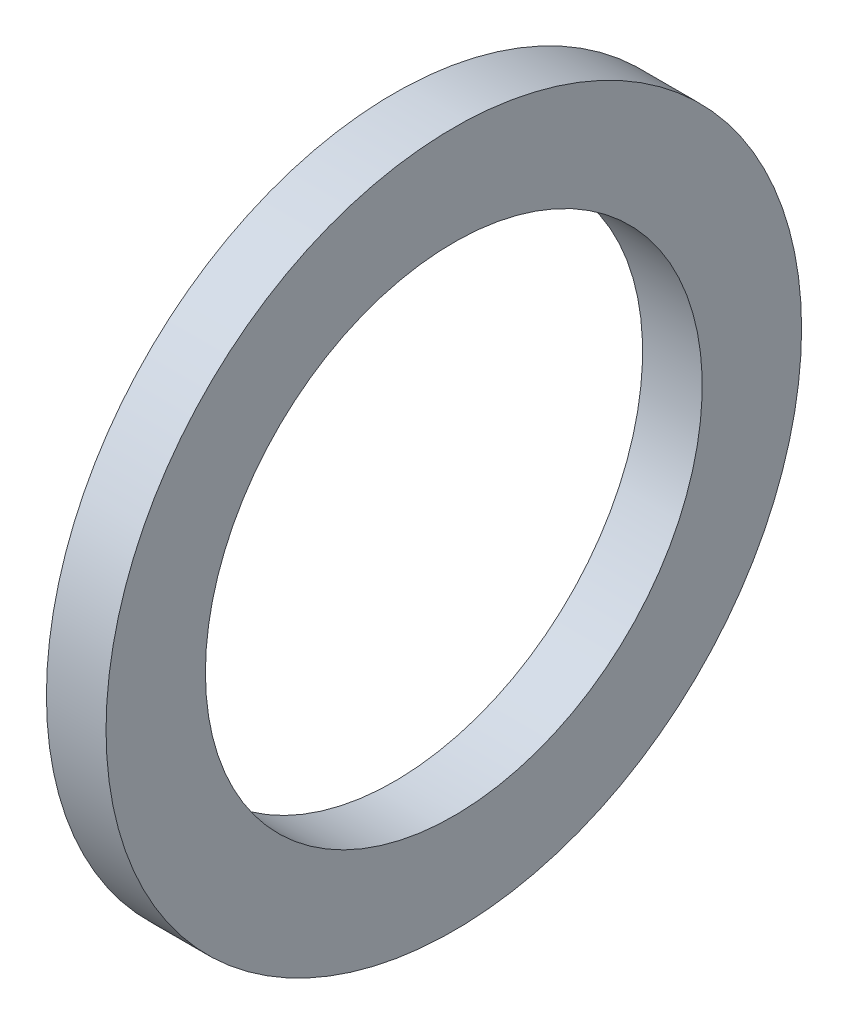
ISO-10303-21;
HEADER;
FILE_DESCRIPTION(('STEP AP214'),'2;1');
FILE_NAME('part.step','',(''),(''),'','','');
FILE_SCHEMA(('AUTOMOTIVE_DESIGN { 1 0 10303 214 1 1 1 1 }'));
ENDSEC;
DATA;
#1=APPLICATION_CONTEXT('core data for automotive mechanical design processes');
#2=APPLICATION_PROTOCOL_DEFINITION('international standard','automotive_design',2000,#1);
#3=PRODUCT_CONTEXT('',#1,'mechanical');
#4=PRODUCT('Part','Part','',(#3));
#5=PRODUCT_RELATED_PRODUCT_CATEGORY('part','',(#4));
#6=PRODUCT_DEFINITION_FORMATION('','',#4);
#7=PRODUCT_DEFINITION_CONTEXT('part definition',#1,'design');
#8=PRODUCT_DEFINITION('design','',#6,#7);
#9=PRODUCT_DEFINITION_SHAPE('','',#8);
#10=(LENGTH_UNIT() NAMED_UNIT(*) SI_UNIT(.MILLI.,.METRE.));
#11=(NAMED_UNIT(*) PLANE_ANGLE_UNIT() SI_UNIT($,.RADIAN.));
#12=(NAMED_UNIT(*) SI_UNIT($,.STERADIAN.) SOLID_ANGLE_UNIT());
#13=UNCERTAINTY_MEASURE_WITH_UNIT(LENGTH_MEASURE(1.E-05),#10,'distance_accuracy_value','');
#14=(GEOMETRIC_REPRESENTATION_CONTEXT(3) GLOBAL_UNCERTAINTY_ASSIGNED_CONTEXT((#13)) GLOBAL_UNIT_ASSIGNED_CONTEXT((#10,
#11,#12)) REPRESENTATION_CONTEXT('',''));
#15=CARTESIAN_POINT('',(0.,0.,0.));
#16=DIRECTION('',(0.,0.,1.));
#17=DIRECTION('',(1.,0.,0.));
#18=AXIS2_PLACEMENT_3D('',#15,#16,#17);
#19=CARTESIAN_POINT('',(0.762,0.,0.));
#20=DIRECTION('',(1.,0.,0.));
#21=DIRECTION('',(0.,0.,-1.));
#22=AXIS2_PLACEMENT_3D('',#19,#20,#21);
#23=PLANE('',#22);
#24=CARTESIAN_POINT('',(0.762,0.,0.));
#25=DIRECTION('',(1.,0.,0.));
#26=DIRECTION('',(0.,0.,-1.));
#27=AXIS2_PLACEMENT_3D('',#24,#25,#26);
#28=CIRCLE('',#27,4.445);
#29=CARTESIAN_POINT('',(0.762,0.,4.445));
#30=VERTEX_POINT('',#29);
#31=EDGE_CURVE('E10',#30,#30,#28,.T.);
#32=ORIENTED_EDGE('',*,*,#31,.T.);
#33=EDGE_LOOP('',(#32));
#34=FACE_BOUND('',#33,.T.);
#35=CARTESIAN_POINT('',(0.762,0.,0.));
#36=DIRECTION('',(1.,0.,0.));
#37=DIRECTION('',(0.,0.,-1.));
#38=AXIS2_PLACEMENT_3D('',#35,#36,#37);
#39=CIRCLE('',#38,3.175);
#40=CARTESIAN_POINT('',(0.762,0.,3.175));
#41=VERTEX_POINT('',#40);
#42=EDGE_CURVE('E46',#41,#41,#39,.T.);
#43=ORIENTED_EDGE('',*,*,#42,.F.);
#44=EDGE_LOOP('',(#43));
#45=FACE_BOUND('',#44,.T.);
#46=ADVANCED_FACE('F35',(#34,#45),#23,.T.);
#47=CARTESIAN_POINT('',(0.,0.,0.));
#48=DIRECTION('',(1.,0.,0.));
#49=DIRECTION('',(0.,0.,-1.));
#50=AXIS2_PLACEMENT_3D('',#47,#48,#49);
#51=PLANE('',#50);
#52=CARTESIAN_POINT('',(0.,0.,0.));
#53=DIRECTION('',(1.,0.,0.));
#54=DIRECTION('',(0.,0.,-1.));
#55=AXIS2_PLACEMENT_3D('',#52,#53,#54);
#56=CIRCLE('',#55,4.445);
#57=CARTESIAN_POINT('',(0.,0.,4.445));
#58=VERTEX_POINT('',#57);
#59=EDGE_CURVE('E39',#58,#58,#56,.T.);
#60=ORIENTED_EDGE('',*,*,#59,.F.);
#61=EDGE_LOOP('',(#60));
#62=FACE_BOUND('',#61,.T.);
#63=CARTESIAN_POINT('',(0.,0.,0.));
#64=DIRECTION('',(1.,0.,0.));
#65=DIRECTION('',(0.,0.,-1.));
#66=AXIS2_PLACEMENT_3D('',#63,#64,#65);
#67=CIRCLE('',#66,3.175);
#68=CARTESIAN_POINT('',(0.,0.,3.175));
#69=VERTEX_POINT('',#68);
#70=EDGE_CURVE('E48',#69,#69,#67,.T.);
#71=ORIENTED_EDGE('',*,*,#70,.T.);
#72=EDGE_LOOP('',(#71));
#73=FACE_BOUND('',#72,.T.);
#74=ADVANCED_FACE('F58',(#62,#73),#51,.F.);
#75=CARTESIAN_POINT('',(0.762,0.,0.));
#76=DIRECTION('',(-1.,0.,0.));
#77=DIRECTION('',(0.,0.,1.));
#78=AXIS2_PLACEMENT_3D('',#75,#76,#77);
#79=CYLINDRICAL_SURFACE('',#78,4.445);
#80=CARTESIAN_POINT('',(0.762,0.,4.445));
#81=CARTESIAN_POINT('',(0.7540625,0.,4.445));
#82=CARTESIAN_POINT('',(0.746125,0.,4.445));
#83=CARTESIAN_POINT('',(0.73025,0.,4.445));
#84=CARTESIAN_POINT('',(0.7223125,0.,4.445));
#85=CARTESIAN_POINT('',(0.7064375,0.,4.445));
#86=CARTESIAN_POINT('',(0.6985,0.,4.445));
#87=CARTESIAN_POINT('',(0.682625,0.,4.445));
#88=CARTESIAN_POINT('',(0.6746875,0.,4.445));
#89=CARTESIAN_POINT('',(0.6588125,0.,4.445));
#90=CARTESIAN_POINT('',(0.650875,0.,4.445));
#91=CARTESIAN_POINT('',(0.635,0.,4.445));
#92=CARTESIAN_POINT('',(0.6270625,0.,4.445));
#93=CARTESIAN_POINT('',(0.6111875,0.,4.445));
#94=CARTESIAN_POINT('',(0.60325,0.,4.445));
#95=CARTESIAN_POINT('',(0.587375,0.,4.445));
#96=CARTESIAN_POINT('',(0.5794375,0.,4.445));
#97=CARTESIAN_POINT('',(0.5635625,0.,4.445));
#98=CARTESIAN_POINT('',(0.555625,0.,4.445));
#99=CARTESIAN_POINT('',(0.53975,0.,4.445));
#100=CARTESIAN_POINT('',(0.5318125,0.,4.445));
#101=CARTESIAN_POINT('',(0.5159375,0.,4.445));
#102=CARTESIAN_POINT('',(0.508,0.,4.445));
#103=CARTESIAN_POINT('',(0.492125,0.,4.445));
#104=CARTESIAN_POINT('',(0.4841875,0.,4.445));
#105=CARTESIAN_POINT('',(0.4683125,0.,4.445));
#106=CARTESIAN_POINT('',(0.460375,0.,4.445));
#107=CARTESIAN_POINT('',(0.4445,0.,4.445));
#108=CARTESIAN_POINT('',(0.4365625,0.,4.445));
#109=CARTESIAN_POINT('',(0.4206875,0.,4.445));
#110=CARTESIAN_POINT('',(0.41275,0.,4.445));
#111=CARTESIAN_POINT('',(0.396875,0.,4.445));
#112=CARTESIAN_POINT('',(0.3889375,0.,4.445));
#113=CARTESIAN_POINT('',(0.3730625,0.,4.445));
#114=CARTESIAN_POINT('',(0.365125,0.,4.445));
#115=CARTESIAN_POINT('',(0.34925,0.,4.445));
#116=CARTESIAN_POINT('',(0.3413125,0.,4.445));
#117=CARTESIAN_POINT('',(0.3254375,0.,4.445));
#118=CARTESIAN_POINT('',(0.3175,0.,4.445));
#119=CARTESIAN_POINT('',(0.301625,0.,4.445));
#120=CARTESIAN_POINT('',(0.2936875,0.,4.445));
#121=CARTESIAN_POINT('',(0.2778125,0.,4.445));
#122=CARTESIAN_POINT('',(0.269875,0.,4.445));
#123=CARTESIAN_POINT('',(0.254,0.,4.445));
#124=CARTESIAN_POINT('',(0.2460625,0.,4.445));
#125=CARTESIAN_POINT('',(0.2301875,0.,4.445));
#126=CARTESIAN_POINT('',(0.22225,0.,4.445));
#127=CARTESIAN_POINT('',(0.206375,0.,4.445));
#128=CARTESIAN_POINT('',(0.1984375,0.,4.445));
#129=CARTESIAN_POINT('',(0.1825625,0.,4.445));
#130=CARTESIAN_POINT('',(0.174625,0.,4.445));
#131=CARTESIAN_POINT('',(0.15875,0.,4.445));
#132=CARTESIAN_POINT('',(0.1508125,0.,4.445));
#133=CARTESIAN_POINT('',(0.1349375,0.,4.445));
#134=CARTESIAN_POINT('',(0.127,0.,4.445));
#135=CARTESIAN_POINT('',(0.111125,0.,4.445));
#136=CARTESIAN_POINT('',(0.1031875,0.,4.445));
#137=CARTESIAN_POINT('',(0.0873125,0.,4.445));
#138=CARTESIAN_POINT('',(0.079375,0.,4.445));
#139=CARTESIAN_POINT('',(0.0635,0.,4.445));
#140=CARTESIAN_POINT('',(0.0555625,0.,4.445));
#141=CARTESIAN_POINT('',(0.0396875,0.,4.445));
#142=CARTESIAN_POINT('',(0.03175,0.,4.445));
#143=CARTESIAN_POINT('',(0.015875,0.,4.445));
#144=CARTESIAN_POINT('',(0.00793749999999999,0.,4.445));
#145=CARTESIAN_POINT('',(0.,0.,4.445));
#146=B_SPLINE_CURVE_WITH_KNOTS('',3,(#80,#81,#82,#83,#84,#85,#86,#87,#88,#89,#90,#91,#92,#93,
#94,#95,#96,#97,#98,#99,#100,#101,#102,#103,#104,#105,#106,#107,#108,#109,#110,#111,#112,#113,
#114,#115,#116,#117,#118,#119,#120,#121,#122,#123,#124,#125,#126,#127,#128,#129,#130,#131,#132,
#133,#134,#135,#136,#137,#138,#139,#140,#141,#142,#143,#144,#145),.UNSPECIFIED.,.F.,.F.,(4,2,2,
2,2,2,2,2,2,2,2,2,2,2,2,2,2,2,2,2,2,2,2,2,2,2,2,2,2,2,2,2,4),(0.,0.0238125,0.0476249999999999,
0.0714374999999999,0.09525,0.1190625,0.142875,0.1666875,0.1905,0.2143125,0.238125,0.2619375,
0.28575,0.3095625,0.333375,0.3571875,0.381,0.4048125,0.428625,0.4524375,0.47625,0.5000625,
0.523875,0.5476875,0.5715,0.5953125,0.619125,0.6429375,0.66675,0.6905625,0.714375,0.7381875,
0.762),.UNSPECIFIED.);
#147=EDGE_CURVE('BSEAM37',#30,#58,#146,.T.);
#148=ORIENTED_EDGE('',*,*,#31,.F.);
#149=ORIENTED_EDGE('',*,*,#59,.T.);
#150=ORIENTED_EDGE('',*,*,#147,.T.);
#151=ORIENTED_EDGE('',*,*,#147,.F.);
#152=EDGE_LOOP('',(#148,#150,#149,#151));
#153=FACE_BOUND('',#152,.T.);
#154=ADVANCED_FACE('F37',(#153),#79,.T.);
#155=CARTESIAN_POINT('',(0.762,0.,0.));
#156=DIRECTION('',(-1.,0.,0.));
#157=DIRECTION('',(0.,0.,1.));
#158=AXIS2_PLACEMENT_3D('',#155,#156,#157);
#159=CYLINDRICAL_SURFACE('',#158,3.175);
#160=CARTESIAN_POINT('',(0.762,0.,3.175));
#161=CARTESIAN_POINT('',(0.7540625,0.,3.175));
#162=CARTESIAN_POINT('',(0.746125,0.,3.175));
#163=CARTESIAN_POINT('',(0.73025,0.,3.175));
#164=CARTESIAN_POINT('',(0.7223125,0.,3.175));
#165=CARTESIAN_POINT('',(0.7064375,0.,3.175));
#166=CARTESIAN_POINT('',(0.6985,0.,3.175));
#167=CARTESIAN_POINT('',(0.682625,0.,3.175));
#168=CARTESIAN_POINT('',(0.6746875,0.,3.175));
#169=CARTESIAN_POINT('',(0.6588125,0.,3.175));
#170=CARTESIAN_POINT('',(0.650875,0.,3.175));
#171=CARTESIAN_POINT('',(0.635,0.,3.175));
#172=CARTESIAN_POINT('',(0.6270625,0.,3.175));
#173=CARTESIAN_POINT('',(0.6111875,0.,3.175));
#174=CARTESIAN_POINT('',(0.60325,0.,3.175));
#175=CARTESIAN_POINT('',(0.587375,0.,3.175));
#176=CARTESIAN_POINT('',(0.5794375,0.,3.175));
#177=CARTESIAN_POINT('',(0.5635625,0.,3.175));
#178=CARTESIAN_POINT('',(0.555625,0.,3.175));
#179=CARTESIAN_POINT('',(0.53975,0.,3.175));
#180=CARTESIAN_POINT('',(0.5318125,0.,3.175));
#181=CARTESIAN_POINT('',(0.5159375,0.,3.175));
#182=CARTESIAN_POINT('',(0.508,0.,3.175));
#183=CARTESIAN_POINT('',(0.492125,0.,3.175));
#184=CARTESIAN_POINT('',(0.4841875,0.,3.175));
#185=CARTESIAN_POINT('',(0.4683125,0.,3.175));
#186=CARTESIAN_POINT('',(0.460375,0.,3.175));
#187=CARTESIAN_POINT('',(0.4445,0.,3.175));
#188=CARTESIAN_POINT('',(0.4365625,0.,3.175));
#189=CARTESIAN_POINT('',(0.4206875,0.,3.175));
#190=CARTESIAN_POINT('',(0.41275,0.,3.175));
#191=CARTESIAN_POINT('',(0.396875,0.,3.175));
#192=CARTESIAN_POINT('',(0.3889375,0.,3.175));
#193=CARTESIAN_POINT('',(0.3730625,0.,3.175));
#194=CARTESIAN_POINT('',(0.365125,0.,3.175));
#195=CARTESIAN_POINT('',(0.34925,0.,3.175));
#196=CARTESIAN_POINT('',(0.3413125,0.,3.175));
#197=CARTESIAN_POINT('',(0.3254375,0.,3.175));
#198=CARTESIAN_POINT('',(0.3175,0.,3.175));
#199=CARTESIAN_POINT('',(0.301625,0.,3.175));
#200=CARTESIAN_POINT('',(0.2936875,0.,3.175));
#201=CARTESIAN_POINT('',(0.2778125,0.,3.175));
#202=CARTESIAN_POINT('',(0.269875,0.,3.175));
#203=CARTESIAN_POINT('',(0.254,0.,3.175));
#204=CARTESIAN_POINT('',(0.2460625,0.,3.175));
#205=CARTESIAN_POINT('',(0.2301875,0.,3.175));
#206=CARTESIAN_POINT('',(0.22225,0.,3.175));
#207=CARTESIAN_POINT('',(0.206375,0.,3.175));
#208=CARTESIAN_POINT('',(0.1984375,0.,3.175));
#209=CARTESIAN_POINT('',(0.1825625,0.,3.175));
#210=CARTESIAN_POINT('',(0.174625,0.,3.175));
#211=CARTESIAN_POINT('',(0.15875,0.,3.175));
#212=CARTESIAN_POINT('',(0.1508125,0.,3.175));
#213=CARTESIAN_POINT('',(0.1349375,0.,3.175));
#214=CARTESIAN_POINT('',(0.127,0.,3.175));
#215=CARTESIAN_POINT('',(0.111125,0.,3.175));
#216=CARTESIAN_POINT('',(0.1031875,0.,3.175));
#217=CARTESIAN_POINT('',(0.0873125,0.,3.175));
#218=CARTESIAN_POINT('',(0.079375,0.,3.175));
#219=CARTESIAN_POINT('',(0.0635,0.,3.175));
#220=CARTESIAN_POINT('',(0.0555625,0.,3.175));
#221=CARTESIAN_POINT('',(0.0396875,0.,3.175));
#222=CARTESIAN_POINT('',(0.03175,0.,3.175));
#223=CARTESIAN_POINT('',(0.015875,0.,3.175));
#224=CARTESIAN_POINT('',(0.00793749999999999,0.,3.175));
#225=CARTESIAN_POINT('',(0.,0.,3.175));
#226=B_SPLINE_CURVE_WITH_KNOTS('',3,(#160,#161,#162,#163,#164,#165,#166,#167,#168,#169,#170,
#171,#172,#173,#174,#175,#176,#177,#178,#179,#180,#181,#182,#183,#184,#185,#186,#187,#188,#189,
#190,#191,#192,#193,#194,#195,#196,#197,#198,#199,#200,#201,#202,#203,#204,#205,#206,#207,#208,
#209,#210,#211,#212,#213,#214,#215,#216,#217,#218,#219,#220,#221,#222,#223,#224,#225),
.UNSPECIFIED.,.F.,.F.,(4,2,2,2,2,2,2,2,2,2,2,2,2,2,2,2,2,2,2,2,2,2,2,2,2,2,2,2,2,2,2,2,4),(0.,
0.0238125000000001,0.047625,0.0714375,0.0952500000000001,0.1190625,0.142875,0.1666875,0.1905,
0.2143125,0.238125,0.2619375,0.28575,0.3095625,0.333375,0.3571875,0.381,0.4048125,0.428625,
0.4524375,0.47625,0.5000625,0.523875,0.5476875,0.5715,0.5953125,0.619125,0.6429375,0.66675,
0.6905625,0.714375,0.7381875,0.762),.UNSPECIFIED.);
#227=EDGE_CURVE('BSEAM54',#41,#69,#226,.T.);
#228=ORIENTED_EDGE('',*,*,#42,.T.);
#229=ORIENTED_EDGE('',*,*,#70,.F.);
#230=ORIENTED_EDGE('',*,*,#227,.T.);
#231=ORIENTED_EDGE('',*,*,#227,.F.);
#232=EDGE_LOOP('',(#228,#230,#229,#231));
#233=FACE_BOUND('',#232,.T.);
#234=ADVANCED_FACE('F54',(#233),#159,.F.);
#235=CLOSED_SHELL('',(#46,#74,#154,#234));
#236=MANIFOLD_SOLID_BREP('B2',#235);
#237=ADVANCED_BREP_SHAPE_REPRESENTATION('',(#18,#236),#14);
#238=SHAPE_DEFINITION_REPRESENTATION(#9,#237);
ENDSEC;
END-ISO-10303-21;
